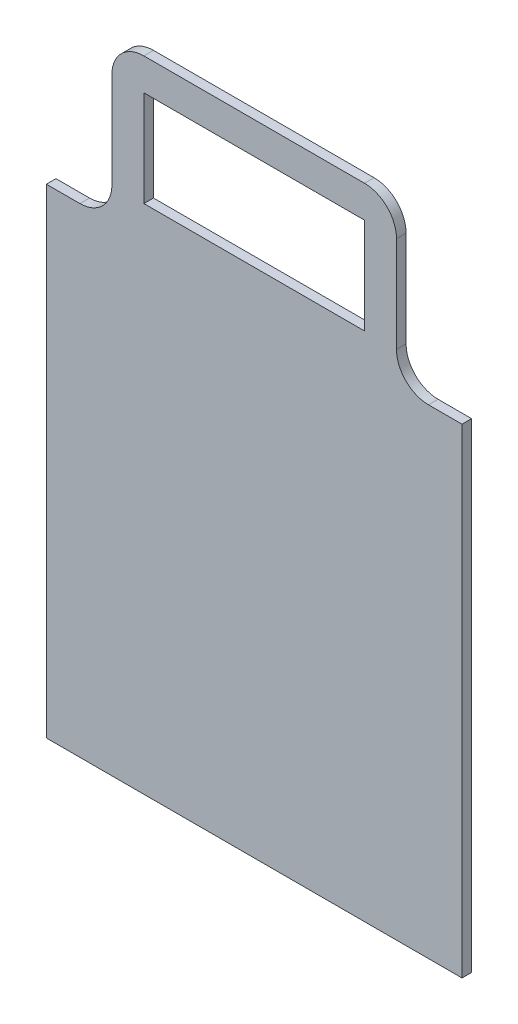
ISO-10303-21;
HEADER;
FILE_DESCRIPTION(('STEP AP214'),'2;1');
FILE_NAME('part.step','',(''),(''),'','','');
FILE_SCHEMA(('AUTOMOTIVE_DESIGN { 1 0 10303 214 1 1 1 1 }'));
ENDSEC;
DATA;
#1=APPLICATION_CONTEXT('core data for automotive mechanical design processes');
#2=APPLICATION_PROTOCOL_DEFINITION('international standard','automotive_design',2000,#1);
#3=PRODUCT_CONTEXT('',#1,'mechanical');
#4=PRODUCT('Part','Part','',(#3));
#5=PRODUCT_RELATED_PRODUCT_CATEGORY('part','',(#4));
#6=PRODUCT_DEFINITION_FORMATION('','',#4);
#7=PRODUCT_DEFINITION_CONTEXT('part definition',#1,'design');
#8=PRODUCT_DEFINITION('design','',#6,#7);
#9=PRODUCT_DEFINITION_SHAPE('','',#8);
#10=(LENGTH_UNIT() NAMED_UNIT(*) SI_UNIT(.MILLI.,.METRE.));
#11=(NAMED_UNIT(*) PLANE_ANGLE_UNIT() SI_UNIT($,.RADIAN.));
#12=(NAMED_UNIT(*) SI_UNIT($,.STERADIAN.) SOLID_ANGLE_UNIT());
#13=UNCERTAINTY_MEASURE_WITH_UNIT(LENGTH_MEASURE(1.E-05),#10,'distance_accuracy_value','');
#14=(GEOMETRIC_REPRESENTATION_CONTEXT(3) GLOBAL_UNCERTAINTY_ASSIGNED_CONTEXT((#13)) GLOBAL_UNIT_ASSIGNED_CONTEXT((#10,
#11,#12)) REPRESENTATION_CONTEXT('',''));
#15=CARTESIAN_POINT('',(0.,0.,0.));
#16=DIRECTION('',(0.,0.,1.));
#17=DIRECTION('',(1.,0.,0.));
#18=AXIS2_PLACEMENT_3D('',#15,#16,#17);
#19=CARTESIAN_POINT('',(-54.5,85.,3.));
#20=DIRECTION('',(0.,0.,1.));
#21=DIRECTION('',(1.,0.,0.));
#22=AXIS2_PLACEMENT_3D('',#19,#20,#21);
#23=PLANE('',#22);
#24=DIRECTION('',(0.,1.,0.));
#25=VECTOR('',#24,1.);
#26=CARTESIAN_POINT('',(65.,75.,3.));
#27=LINE('',#26,#25);
#28=CARTESIAN_POINT('',(65.,-75.,3.));
#29=VERTEX_POINT('',#28);
#30=CARTESIAN_POINT('',(65.,75.,3.));
#31=VERTEX_POINT('',#30);
#32=EDGE_CURVE('E201',#29,#31,#27,.T.);
#33=ORIENTED_EDGE('',*,*,#32,.T.);
#34=DIRECTION('',(-1.,0.,0.));
#35=VECTOR('',#34,1.);
#36=CARTESIAN_POINT('',(54.5000000000001,75.,3.));
#37=LINE('',#36,#35);
#38=CARTESIAN_POINT('',(54.5000000000001,75.,3.));
#39=VERTEX_POINT('',#38);
#40=EDGE_CURVE('E205',#31,#39,#37,.T.);
#41=ORIENTED_EDGE('',*,*,#40,.T.);
#42=CARTESIAN_POINT('',(54.5,85.,3.));
#43=DIRECTION('',(0.,0.,-1.));
#44=DIRECTION('',(-1.,0.,0.));
#45=AXIS2_PLACEMENT_3D('',#42,#43,#44);
#46=CIRCLE('',#45,10.);
#47=CARTESIAN_POINT('',(44.5,85.0000000000001,3.));
#48=VERTEX_POINT('',#47);
#49=EDGE_CURVE('E209',#39,#48,#46,.T.);
#50=ORIENTED_EDGE('',*,*,#49,.T.);
#51=DIRECTION('',(0.,1.,0.));
#52=VECTOR('',#51,1.);
#53=CARTESIAN_POINT('',(44.5,85.0000000000001,3.));
#54=LINE('',#53,#52);
#55=CARTESIAN_POINT('',(44.5,115.,3.));
#56=VERTEX_POINT('',#55);
#57=EDGE_CURVE('E212',#48,#56,#54,.T.);
#58=ORIENTED_EDGE('',*,*,#57,.T.);
#59=CARTESIAN_POINT('',(34.5,115.,3.));
#60=DIRECTION('',(0.,0.,1.));
#61=DIRECTION('',(1.,0.,0.));
#62=AXIS2_PLACEMENT_3D('',#59,#60,#61);
#63=CIRCLE('',#62,9.99999999999999);
#64=CARTESIAN_POINT('',(34.4999999999999,125.,3.));
#65=VERTEX_POINT('',#64);
#66=EDGE_CURVE('E215',#56,#65,#63,.T.);
#67=ORIENTED_EDGE('',*,*,#66,.T.);
#68=DIRECTION('',(-1.,0.,0.));
#69=VECTOR('',#68,1.);
#70=CARTESIAN_POINT('',(34.4999999999999,125.,3.));
#71=LINE('',#70,#69);
#72=CARTESIAN_POINT('',(-34.4999999999999,125.,3.));
#73=VERTEX_POINT('',#72);
#74=EDGE_CURVE('E218',#65,#73,#71,.T.);
#75=ORIENTED_EDGE('',*,*,#74,.T.);
#76=CARTESIAN_POINT('',(-34.5,115.,3.));
#77=DIRECTION('',(0.,0.,1.));
#78=DIRECTION('',(1.,0.,0.));
#79=AXIS2_PLACEMENT_3D('',#76,#77,#78);
#80=CIRCLE('',#79,9.99999999999999);
#81=CARTESIAN_POINT('',(-44.5,115.,3.));
#82=VERTEX_POINT('',#81);
#83=EDGE_CURVE('E221',#73,#82,#80,.T.);
#84=ORIENTED_EDGE('',*,*,#83,.T.);
#85=DIRECTION('',(0.,-1.,0.));
#86=VECTOR('',#85,1.);
#87=CARTESIAN_POINT('',(-44.5,85.0000000000001,3.));
#88=LINE('',#87,#86);
#89=CARTESIAN_POINT('',(-44.5,85.,3.));
#90=VERTEX_POINT('',#89);
#91=EDGE_CURVE('E224',#82,#90,#88,.T.);
#92=ORIENTED_EDGE('',*,*,#91,.T.);
#93=CARTESIAN_POINT('',(-54.5,85.,3.));
#94=DIRECTION('',(0.,0.,-1.));
#95=DIRECTION('',(1.,0.,0.));
#96=AXIS2_PLACEMENT_3D('',#93,#94,#95);
#97=CIRCLE('',#96,10.);
#98=CARTESIAN_POINT('',(-54.5000000000001,75.,3.));
#99=VERTEX_POINT('',#98);
#100=EDGE_CURVE('E227',#90,#99,#97,.T.);
#101=ORIENTED_EDGE('',*,*,#100,.T.);
#102=DIRECTION('',(-1.,0.,0.));
#103=VECTOR('',#102,1.);
#104=CARTESIAN_POINT('',(-65.,75.,3.));
#105=LINE('',#104,#103);
#106=CARTESIAN_POINT('',(-65.,75.,3.));
#107=VERTEX_POINT('',#106);
#108=EDGE_CURVE('E230',#99,#107,#105,.T.);
#109=ORIENTED_EDGE('',*,*,#108,.T.);
#110=DIRECTION('',(0.,-1.,0.));
#111=VECTOR('',#110,1.);
#112=CARTESIAN_POINT('',(-65.,75.,3.));
#113=LINE('',#112,#111);
#114=CARTESIAN_POINT('',(-65.,-75.,3.));
#115=VERTEX_POINT('',#114);
#116=EDGE_CURVE('E233',#107,#115,#113,.T.);
#117=ORIENTED_EDGE('',*,*,#116,.T.);
#118=DIRECTION('',(1.,0.,0.));
#119=VECTOR('',#118,1.);
#120=CARTESIAN_POINT('',(-65.,-75.,3.));
#121=LINE('',#120,#119);
#122=EDGE_CURVE('E236',#115,#29,#121,.T.);
#123=ORIENTED_EDGE('',*,*,#122,.T.);
#124=EDGE_LOOP('',(#33,#41,#50,#58,#67,#75,#84,#92,#101,#109,#117,#123));
#125=FACE_BOUND('',#124,.T.);
#126=DIRECTION('',(-1.,0.,0.));
#127=VECTOR('',#126,1.);
#128=CARTESIAN_POINT('',(-34.5,115.,3.));
#129=LINE('',#128,#127);
#130=CARTESIAN_POINT('',(34.5,115.,3.));
#131=VERTEX_POINT('',#130);
#132=CARTESIAN_POINT('',(-34.5,115.,3.));
#133=VERTEX_POINT('',#132);
#134=EDGE_CURVE('E162',#131,#133,#129,.T.);
#135=ORIENTED_EDGE('',*,*,#134,.F.);
#136=DIRECTION('',(0.,1.,0.));
#137=VECTOR('',#136,1.);
#138=CARTESIAN_POINT('',(34.5,85.,3.));
#139=LINE('',#138,#137);
#140=CARTESIAN_POINT('',(34.5,85.,3.));
#141=VERTEX_POINT('',#140);
#142=EDGE_CURVE('E153',#141,#131,#139,.T.);
#143=ORIENTED_EDGE('',*,*,#142,.F.);
#144=DIRECTION('',(1.,0.,0.));
#145=VECTOR('',#144,1.);
#146=CARTESIAN_POINT('',(-34.5,85.,3.));
#147=LINE('',#146,#145);
#148=CARTESIAN_POINT('',(-34.5,85.,3.));
#149=VERTEX_POINT('',#148);
#150=EDGE_CURVE('E179',#149,#141,#147,.T.);
#151=ORIENTED_EDGE('',*,*,#150,.F.);
#152=DIRECTION('',(0.,-1.,0.));
#153=VECTOR('',#152,1.);
#154=CARTESIAN_POINT('',(-34.5,85.,3.));
#155=LINE('',#154,#153);
#156=EDGE_CURVE('E175',#133,#149,#155,.T.);
#157=ORIENTED_EDGE('',*,*,#156,.F.);
#158=EDGE_LOOP('',(#135,#143,#151,#157));
#159=FACE_BOUND('',#158,.T.);
#160=ADVANCED_FACE('F39',(#125,#159),#23,.T.);
#161=CARTESIAN_POINT('',(-54.5,85.,0.));
#162=DIRECTION('',(0.,0.,1.));
#163=DIRECTION('',(1.,0.,0.));
#164=AXIS2_PLACEMENT_3D('',#161,#162,#163);
#165=PLANE('',#164);
#166=DIRECTION('',(0.,1.,0.));
#167=VECTOR('',#166,1.);
#168=CARTESIAN_POINT('',(65.,75.,0.));
#169=LINE('',#168,#167);
#170=CARTESIAN_POINT('',(65.,-75.,0.));
#171=VERTEX_POINT('',#170);
#172=CARTESIAN_POINT('',(65.,75.,0.));
#173=VERTEX_POINT('',#172);
#174=EDGE_CURVE('E171',#171,#173,#169,.T.);
#175=ORIENTED_EDGE('',*,*,#174,.F.);
#176=DIRECTION('',(1.,0.,0.));
#177=VECTOR('',#176,1.);
#178=CARTESIAN_POINT('',(-65.,-75.,0.));
#179=LINE('',#178,#177);
#180=CARTESIAN_POINT('',(-65.,-75.,0.));
#181=VERTEX_POINT('',#180);
#182=EDGE_CURVE('E206',#181,#171,#179,.T.);
#183=ORIENTED_EDGE('',*,*,#182,.F.);
#184=DIRECTION('',(0.,-1.,0.));
#185=VECTOR('',#184,1.);
#186=CARTESIAN_POINT('',(-65.,75.,0.));
#187=LINE('',#186,#185);
#188=CARTESIAN_POINT('',(-65.,75.,0.));
#189=VERTEX_POINT('',#188);
#190=EDGE_CURVE('E270',#189,#181,#187,.T.);
#191=ORIENTED_EDGE('',*,*,#190,.F.);
#192=DIRECTION('',(-1.,0.,0.));
#193=VECTOR('',#192,1.);
#194=CARTESIAN_POINT('',(-65.,75.,0.));
#195=LINE('',#194,#193);
#196=CARTESIAN_POINT('',(-54.5000000000001,75.,0.));
#197=VERTEX_POINT('',#196);
#198=EDGE_CURVE('E267',#197,#189,#195,.T.);
#199=ORIENTED_EDGE('',*,*,#198,.F.);
#200=CARTESIAN_POINT('',(-54.5,85.,0.));
#201=DIRECTION('',(0.,0.,-1.));
#202=DIRECTION('',(1.,0.,0.));
#203=AXIS2_PLACEMENT_3D('',#200,#201,#202);
#204=CIRCLE('',#203,10.);
#205=CARTESIAN_POINT('',(-44.5,85.,0.));
#206=VERTEX_POINT('',#205);
#207=EDGE_CURVE('E264',#206,#197,#204,.T.);
#208=ORIENTED_EDGE('',*,*,#207,.F.);
#209=DIRECTION('',(0.,-1.,0.));
#210=VECTOR('',#209,1.);
#211=CARTESIAN_POINT('',(-44.5,85.0000000000001,0.));
#212=LINE('',#211,#210);
#213=CARTESIAN_POINT('',(-44.5,115.,0.));
#214=VERTEX_POINT('',#213);
#215=EDGE_CURVE('E261',#214,#206,#212,.T.);
#216=ORIENTED_EDGE('',*,*,#215,.F.);
#217=CARTESIAN_POINT('',(-34.5,115.,0.));
#218=DIRECTION('',(0.,0.,1.));
#219=DIRECTION('',(1.,0.,0.));
#220=AXIS2_PLACEMENT_3D('',#217,#218,#219);
#221=CIRCLE('',#220,9.99999999999999);
#222=CARTESIAN_POINT('',(-34.4999999999999,125.,0.));
#223=VERTEX_POINT('',#222);
#224=EDGE_CURVE('E258',#223,#214,#221,.T.);
#225=ORIENTED_EDGE('',*,*,#224,.F.);
#226=DIRECTION('',(-1.,0.,0.));
#227=VECTOR('',#226,1.);
#228=CARTESIAN_POINT('',(34.4999999999999,125.,0.));
#229=LINE('',#228,#227);
#230=CARTESIAN_POINT('',(34.4999999999999,125.,0.));
#231=VERTEX_POINT('',#230);
#232=EDGE_CURVE('E255',#231,#223,#229,.T.);
#233=ORIENTED_EDGE('',*,*,#232,.F.);
#234=CARTESIAN_POINT('',(34.5,115.,0.));
#235=DIRECTION('',(0.,0.,1.));
#236=DIRECTION('',(1.,0.,0.));
#237=AXIS2_PLACEMENT_3D('',#234,#235,#236);
#238=CIRCLE('',#237,9.99999999999999);
#239=CARTESIAN_POINT('',(44.5,115.,0.));
#240=VERTEX_POINT('',#239);
#241=EDGE_CURVE('E252',#240,#231,#238,.T.);
#242=ORIENTED_EDGE('',*,*,#241,.F.);
#243=DIRECTION('',(0.,1.,0.));
#244=VECTOR('',#243,1.);
#245=CARTESIAN_POINT('',(44.5,85.0000000000001,0.));
#246=LINE('',#245,#244);
#247=CARTESIAN_POINT('',(44.5,85.0000000000001,0.));
#248=VERTEX_POINT('',#247);
#249=EDGE_CURVE('E249',#248,#240,#246,.T.);
#250=ORIENTED_EDGE('',*,*,#249,.F.);
#251=CARTESIAN_POINT('',(54.5,85.,0.));
#252=DIRECTION('',(0.,0.,-1.));
#253=DIRECTION('',(-1.,0.,0.));
#254=AXIS2_PLACEMENT_3D('',#251,#252,#253);
#255=CIRCLE('',#254,10.);
#256=CARTESIAN_POINT('',(54.5000000000001,75.,0.));
#257=VERTEX_POINT('',#256);
#258=EDGE_CURVE('E246',#257,#248,#255,.T.);
#259=ORIENTED_EDGE('',*,*,#258,.F.);
#260=DIRECTION('',(-1.,0.,0.));
#261=VECTOR('',#260,1.);
#262=CARTESIAN_POINT('',(54.5000000000001,75.,0.));
#263=LINE('',#262,#261);
#264=EDGE_CURVE('E243',#173,#257,#263,.T.);
#265=ORIENTED_EDGE('',*,*,#264,.F.);
#266=EDGE_LOOP('',(#175,#183,#191,#199,#208,#216,#225,#233,#242,#250,#259,#265));
#267=FACE_BOUND('',#266,.T.);
#268=DIRECTION('',(0.,1.,0.));
#269=VECTOR('',#268,1.);
#270=CARTESIAN_POINT('',(34.5,85.,0.));
#271=LINE('',#270,#269);
#272=CARTESIAN_POINT('',(34.5,85.,0.));
#273=VERTEX_POINT('',#272);
#274=CARTESIAN_POINT('',(34.5,115.,0.));
#275=VERTEX_POINT('',#274);
#276=EDGE_CURVE('E63',#273,#275,#271,.T.);
#277=ORIENTED_EDGE('',*,*,#276,.T.);
#278=DIRECTION('',(-1.,0.,0.));
#279=VECTOR('',#278,1.);
#280=CARTESIAN_POINT('',(-34.5,115.,0.));
#281=LINE('',#280,#279);
#282=CARTESIAN_POINT('',(-34.5,115.,0.));
#283=VERTEX_POINT('',#282);
#284=EDGE_CURVE('E169',#275,#283,#281,.T.);
#285=ORIENTED_EDGE('',*,*,#284,.T.);
#286=DIRECTION('',(0.,-1.,0.));
#287=VECTOR('',#286,1.);
#288=CARTESIAN_POINT('',(-34.5,85.,0.));
#289=LINE('',#288,#287);
#290=CARTESIAN_POINT('',(-34.5,85.,0.));
#291=VERTEX_POINT('',#290);
#292=EDGE_CURVE('E188',#283,#291,#289,.T.);
#293=ORIENTED_EDGE('',*,*,#292,.T.);
#294=DIRECTION('',(1.,0.,0.));
#295=VECTOR('',#294,1.);
#296=CARTESIAN_POINT('',(-34.5,85.,0.));
#297=LINE('',#296,#295);
#298=EDGE_CURVE('E163',#291,#273,#297,.T.);
#299=ORIENTED_EDGE('',*,*,#298,.T.);
#300=EDGE_LOOP('',(#277,#285,#293,#299));
#301=FACE_BOUND('',#300,.T.);
#302=ADVANCED_FACE('F325',(#267,#301),#165,.F.);
#303=CARTESIAN_POINT('',(65.,75.,3.));
#304=DIRECTION('',(-1.,0.,0.));
#305=DIRECTION('',(0.,-1.,0.));
#306=AXIS2_PLACEMENT_3D('',#303,#304,#305);
#307=PLANE('',#306);
#308=ORIENTED_EDGE('',*,*,#174,.T.);
#309=DIRECTION('',(0.,0.,-1.));
#310=VECTOR('',#309,1.);
#311=CARTESIAN_POINT('',(65.,75.,3.));
#312=LINE('',#311,#310);
#313=EDGE_CURVE('E11',#31,#173,#312,.T.);
#314=ORIENTED_EDGE('',*,*,#313,.F.);
#315=ORIENTED_EDGE('',*,*,#32,.F.);
#316=DIRECTION('',(0.,0.,-1.));
#317=VECTOR('',#316,1.);
#318=CARTESIAN_POINT('',(65.,-75.,3.));
#319=LINE('',#318,#317);
#320=EDGE_CURVE('E239',#29,#171,#319,.T.);
#321=ORIENTED_EDGE('',*,*,#320,.T.);
#322=EDGE_LOOP('',(#308,#314,#315,#321));
#323=FACE_BOUND('',#322,.T.);
#324=ADVANCED_FACE('F41',(#323),#307,.F.);
#325=CARTESIAN_POINT('',(54.5000000000001,75.,3.));
#326=DIRECTION('',(0.,-1.,0.));
#327=DIRECTION('',(1.,0.,0.));
#328=AXIS2_PLACEMENT_3D('',#325,#326,#327);
#329=PLANE('',#328);
#330=ORIENTED_EDGE('',*,*,#264,.T.);
#331=DIRECTION('',(0.,0.,-1.));
#332=VECTOR('',#331,1.);
#333=CARTESIAN_POINT('',(54.5000000000001,75.,3.));
#334=LINE('',#333,#332);
#335=EDGE_CURVE('E48',#39,#257,#334,.T.);
#336=ORIENTED_EDGE('',*,*,#335,.F.);
#337=ORIENTED_EDGE('',*,*,#40,.F.);
#338=ORIENTED_EDGE('',*,*,#313,.T.);
#339=EDGE_LOOP('',(#330,#336,#337,#338));
#340=FACE_BOUND('',#339,.T.);
#341=ADVANCED_FACE('F342',(#340),#329,.F.);
#342=CARTESIAN_POINT('',(54.5,85.,3.));
#343=DIRECTION('',(0.,0.,-1.));
#344=DIRECTION('',(-1.,0.,0.));
#345=AXIS2_PLACEMENT_3D('',#342,#343,#344);
#346=CYLINDRICAL_SURFACE('',#345,10.);
#347=ORIENTED_EDGE('',*,*,#258,.T.);
#348=DIRECTION('',(0.,0.,-1.));
#349=VECTOR('',#348,1.);
#350=CARTESIAN_POINT('',(44.5,85.0000000000001,3.));
#351=LINE('',#350,#349);
#352=EDGE_CURVE('E310',#48,#248,#351,.T.);
#353=ORIENTED_EDGE('',*,*,#352,.F.);
#354=ORIENTED_EDGE('',*,*,#49,.F.);
#355=ORIENTED_EDGE('',*,*,#335,.T.);
#356=EDGE_LOOP('',(#347,#353,#354,#355));
#357=FACE_BOUND('',#356,.T.);
#358=ADVANCED_FACE('F319',(#357),#346,.F.);
#359=CARTESIAN_POINT('',(44.5,85.0000000000001,3.));
#360=DIRECTION('',(-1.,0.,0.));
#361=DIRECTION('',(0.,-1.,0.));
#362=AXIS2_PLACEMENT_3D('',#359,#360,#361);
#363=PLANE('',#362);
#364=ORIENTED_EDGE('',*,*,#249,.T.);
#365=DIRECTION('',(0.,0.,-1.));
#366=VECTOR('',#365,1.);
#367=CARTESIAN_POINT('',(44.5,115.,3.));
#368=LINE('',#367,#366);
#369=EDGE_CURVE('E306',#56,#240,#368,.T.);
#370=ORIENTED_EDGE('',*,*,#369,.F.);
#371=ORIENTED_EDGE('',*,*,#57,.F.);
#372=ORIENTED_EDGE('',*,*,#352,.T.);
#373=EDGE_LOOP('',(#364,#370,#371,#372));
#374=FACE_BOUND('',#373,.T.);
#375=ADVANCED_FACE('F331',(#374),#363,.F.);
#376=CARTESIAN_POINT('',(34.5,115.,3.));
#377=DIRECTION('',(0.,0.,-1.));
#378=DIRECTION('',(-1.,0.,0.));
#379=AXIS2_PLACEMENT_3D('',#376,#377,#378);
#380=CYLINDRICAL_SURFACE('',#379,9.99999999999999);
#381=ORIENTED_EDGE('',*,*,#241,.T.);
#382=DIRECTION('',(0.,0.,-1.));
#383=VECTOR('',#382,1.);
#384=CARTESIAN_POINT('',(34.4999999999999,125.,3.));
#385=LINE('',#384,#383);
#386=EDGE_CURVE('E302',#65,#231,#385,.T.);
#387=ORIENTED_EDGE('',*,*,#386,.F.);
#388=ORIENTED_EDGE('',*,*,#66,.F.);
#389=ORIENTED_EDGE('',*,*,#369,.T.);
#390=EDGE_LOOP('',(#381,#387,#388,#389));
#391=FACE_BOUND('',#390,.T.);
#392=ADVANCED_FACE('F335',(#391),#380,.T.);
#393=CARTESIAN_POINT('',(34.4999999999999,125.,3.));
#394=DIRECTION('',(0.,-1.,0.));
#395=DIRECTION('',(0.,0.,-1.));
#396=AXIS2_PLACEMENT_3D('',#393,#394,#395);
#397=PLANE('',#396);
#398=ORIENTED_EDGE('',*,*,#232,.T.);
#399=DIRECTION('',(0.,0.,-1.));
#400=VECTOR('',#399,1.);
#401=CARTESIAN_POINT('',(-34.4999999999999,125.,3.));
#402=LINE('',#401,#400);
#403=EDGE_CURVE('E298',#73,#223,#402,.T.);
#404=ORIENTED_EDGE('',*,*,#403,.F.);
#405=ORIENTED_EDGE('',*,*,#74,.F.);
#406=ORIENTED_EDGE('',*,*,#386,.T.);
#407=EDGE_LOOP('',(#398,#404,#405,#406));
#408=FACE_BOUND('',#407,.T.);
#409=ADVANCED_FACE('F375',(#408),#397,.F.);
#410=CARTESIAN_POINT('',(-34.5,115.,3.));
#411=DIRECTION('',(0.,0.,-1.));
#412=DIRECTION('',(-1.,0.,0.));
#413=AXIS2_PLACEMENT_3D('',#410,#411,#412);
#414=CYLINDRICAL_SURFACE('',#413,9.99999999999999);
#415=ORIENTED_EDGE('',*,*,#224,.T.);
#416=DIRECTION('',(0.,0.,-1.));
#417=VECTOR('',#416,1.);
#418=CARTESIAN_POINT('',(-44.5,115.,3.));
#419=LINE('',#418,#417);
#420=EDGE_CURVE('E294',#82,#214,#419,.T.);
#421=ORIENTED_EDGE('',*,*,#420,.F.);
#422=ORIENTED_EDGE('',*,*,#83,.F.);
#423=ORIENTED_EDGE('',*,*,#403,.T.);
#424=EDGE_LOOP('',(#415,#421,#422,#423));
#425=FACE_BOUND('',#424,.T.);
#426=ADVANCED_FACE('F373',(#425),#414,.T.);
#427=CARTESIAN_POINT('',(-44.5,85.0000000000001,3.));
#428=DIRECTION('',(1.,0.,0.));
#429=DIRECTION('',(0.,0.,-1.));
#430=AXIS2_PLACEMENT_3D('',#427,#428,#429);
#431=PLANE('',#430);
#432=ORIENTED_EDGE('',*,*,#215,.T.);
#433=DIRECTION('',(0.,0.,-1.));
#434=VECTOR('',#433,1.);
#435=CARTESIAN_POINT('',(-44.5,85.,3.));
#436=LINE('',#435,#434);
#437=EDGE_CURVE('E290',#90,#206,#436,.T.);
#438=ORIENTED_EDGE('',*,*,#437,.F.);
#439=ORIENTED_EDGE('',*,*,#91,.F.);
#440=ORIENTED_EDGE('',*,*,#420,.T.);
#441=EDGE_LOOP('',(#432,#438,#439,#440));
#442=FACE_BOUND('',#441,.T.);
#443=ADVANCED_FACE('F369',(#442),#431,.F.);
#444=CARTESIAN_POINT('',(-54.5,85.,3.));
#445=DIRECTION('',(0.,0.,-1.));
#446=DIRECTION('',(-1.,0.,0.));
#447=AXIS2_PLACEMENT_3D('',#444,#445,#446);
#448=CYLINDRICAL_SURFACE('',#447,10.);
#449=ORIENTED_EDGE('',*,*,#207,.T.);
#450=DIRECTION('',(0.,0.,-1.));
#451=VECTOR('',#450,1.);
#452=CARTESIAN_POINT('',(-54.5000000000001,75.,3.));
#453=LINE('',#452,#451);
#454=EDGE_CURVE('E286',#99,#197,#453,.T.);
#455=ORIENTED_EDGE('',*,*,#454,.F.);
#456=ORIENTED_EDGE('',*,*,#100,.F.);
#457=ORIENTED_EDGE('',*,*,#437,.T.);
#458=EDGE_LOOP('',(#449,#455,#456,#457));
#459=FACE_BOUND('',#458,.T.);
#460=ADVANCED_FACE('F364',(#459),#448,.F.);
#461=CARTESIAN_POINT('',(-65.,75.,3.));
#462=DIRECTION('',(0.,-1.,0.));
#463=DIRECTION('',(1.,0.,0.));
#464=AXIS2_PLACEMENT_3D('',#461,#462,#463);
#465=PLANE('',#464);
#466=ORIENTED_EDGE('',*,*,#198,.T.);
#467=DIRECTION('',(0.,0.,-1.));
#468=VECTOR('',#467,1.);
#469=CARTESIAN_POINT('',(-65.,75.,3.));
#470=LINE('',#469,#468);
#471=EDGE_CURVE('E282',#107,#189,#470,.T.);
#472=ORIENTED_EDGE('',*,*,#471,.F.);
#473=ORIENTED_EDGE('',*,*,#108,.F.);
#474=ORIENTED_EDGE('',*,*,#454,.T.);
#475=EDGE_LOOP('',(#466,#472,#473,#474));
#476=FACE_BOUND('',#475,.T.);
#477=ADVANCED_FACE('F358',(#476),#465,.F.);
#478=CARTESIAN_POINT('',(-65.,75.,3.));
#479=DIRECTION('',(1.,0.,0.));
#480=DIRECTION('',(0.,1.,0.));
#481=AXIS2_PLACEMENT_3D('',#478,#479,#480);
#482=PLANE('',#481);
#483=ORIENTED_EDGE('',*,*,#190,.T.);
#484=DIRECTION('',(0.,0.,-1.));
#485=VECTOR('',#484,1.);
#486=CARTESIAN_POINT('',(-65.,-75.,3.));
#487=LINE('',#486,#485);
#488=EDGE_CURVE('E278',#115,#181,#487,.T.);
#489=ORIENTED_EDGE('',*,*,#488,.F.);
#490=ORIENTED_EDGE('',*,*,#116,.F.);
#491=ORIENTED_EDGE('',*,*,#471,.T.);
#492=EDGE_LOOP('',(#483,#489,#490,#491));
#493=FACE_BOUND('',#492,.T.);
#494=ADVANCED_FACE('F354',(#493),#482,.F.);
#495=CARTESIAN_POINT('',(-65.,-75.,3.));
#496=DIRECTION('',(0.,1.,0.));
#497=DIRECTION('',(0.,0.,1.));
#498=AXIS2_PLACEMENT_3D('',#495,#496,#497);
#499=PLANE('',#498);
#500=ORIENTED_EDGE('',*,*,#182,.T.);
#501=ORIENTED_EDGE('',*,*,#320,.F.);
#502=ORIENTED_EDGE('',*,*,#122,.F.);
#503=ORIENTED_EDGE('',*,*,#488,.T.);
#504=EDGE_LOOP('',(#500,#501,#502,#503));
#505=FACE_BOUND('',#504,.T.);
#506=ADVANCED_FACE('F349',(#505),#499,.F.);
#507=CARTESIAN_POINT('',(34.5,85.,3.));
#508=DIRECTION('',(-1.,0.,0.));
#509=DIRECTION('',(0.,0.,1.));
#510=AXIS2_PLACEMENT_3D('',#507,#508,#509);
#511=PLANE('',#510);
#512=ORIENTED_EDGE('',*,*,#276,.F.);
#513=DIRECTION('',(0.,0.,-1.));
#514=VECTOR('',#513,1.);
#515=CARTESIAN_POINT('',(34.5,85.,3.));
#516=LINE('',#515,#514);
#517=EDGE_CURVE('E157',#141,#273,#516,.T.);
#518=ORIENTED_EDGE('',*,*,#517,.F.);
#519=ORIENTED_EDGE('',*,*,#142,.T.);
#520=DIRECTION('',(0.,0.,-1.));
#521=VECTOR('',#520,1.);
#522=CARTESIAN_POINT('',(34.5,115.,3.));
#523=LINE('',#522,#521);
#524=EDGE_CURVE('E156',#131,#275,#523,.T.);
#525=ORIENTED_EDGE('',*,*,#524,.T.);
#526=EDGE_LOOP('',(#512,#518,#519,#525));
#527=FACE_BOUND('',#526,.T.);
#528=ADVANCED_FACE('F155',(#527),#511,.T.);
#529=CARTESIAN_POINT('',(-34.5,115.,3.));
#530=DIRECTION('',(0.,-1.,0.));
#531=DIRECTION('',(0.,0.,-1.));
#532=AXIS2_PLACEMENT_3D('',#529,#530,#531);
#533=PLANE('',#532);
#534=ORIENTED_EDGE('',*,*,#284,.F.);
#535=ORIENTED_EDGE('',*,*,#524,.F.);
#536=ORIENTED_EDGE('',*,*,#134,.T.);
#537=DIRECTION('',(0.,0.,-1.));
#538=VECTOR('',#537,1.);
#539=CARTESIAN_POINT('',(-34.5,115.,3.));
#540=LINE('',#539,#538);
#541=EDGE_CURVE('E172',#133,#283,#540,.T.);
#542=ORIENTED_EDGE('',*,*,#541,.T.);
#543=EDGE_LOOP('',(#534,#535,#536,#542));
#544=FACE_BOUND('',#543,.T.);
#545=ADVANCED_FACE('F166',(#544),#533,.T.);
#546=CARTESIAN_POINT('',(-34.5,85.,3.));
#547=DIRECTION('',(1.,0.,0.));
#548=DIRECTION('',(0.,0.,-1.));
#549=AXIS2_PLACEMENT_3D('',#546,#547,#548);
#550=PLANE('',#549);
#551=ORIENTED_EDGE('',*,*,#292,.F.);
#552=ORIENTED_EDGE('',*,*,#541,.F.);
#553=ORIENTED_EDGE('',*,*,#156,.T.);
#554=DIRECTION('',(0.,0.,-1.));
#555=VECTOR('',#554,1.);
#556=CARTESIAN_POINT('',(-34.5,85.,3.));
#557=LINE('',#556,#555);
#558=EDGE_CURVE('E55',#149,#291,#557,.T.);
#559=ORIENTED_EDGE('',*,*,#558,.T.);
#560=EDGE_LOOP('',(#551,#552,#553,#559));
#561=FACE_BOUND('',#560,.T.);
#562=ADVANCED_FACE('F433',(#561),#550,.T.);
#563=CARTESIAN_POINT('',(-34.5,85.,3.));
#564=DIRECTION('',(0.,1.,0.));
#565=DIRECTION('',(0.,0.,1.));
#566=AXIS2_PLACEMENT_3D('',#563,#564,#565);
#567=PLANE('',#566);
#568=ORIENTED_EDGE('',*,*,#298,.F.);
#569=ORIENTED_EDGE('',*,*,#558,.F.);
#570=ORIENTED_EDGE('',*,*,#150,.T.);
#571=ORIENTED_EDGE('',*,*,#517,.T.);
#572=EDGE_LOOP('',(#568,#569,#570,#571));
#573=FACE_BOUND('',#572,.T.);
#574=ADVANCED_FACE('F439',(#573),#567,.T.);
#575=CLOSED_SHELL('',(#160,#302,#324,#341,#358,#375,#392,#409,#426,#443,#460,#477,#494,#506,
#528,#545,#562,#574));
#576=MANIFOLD_SOLID_BREP('B2',#575);
#577=ADVANCED_BREP_SHAPE_REPRESENTATION('',(#18,#576),#14);
#578=SHAPE_DEFINITION_REPRESENTATION(#9,#577);
ENDSEC;
END-ISO-10303-21;
